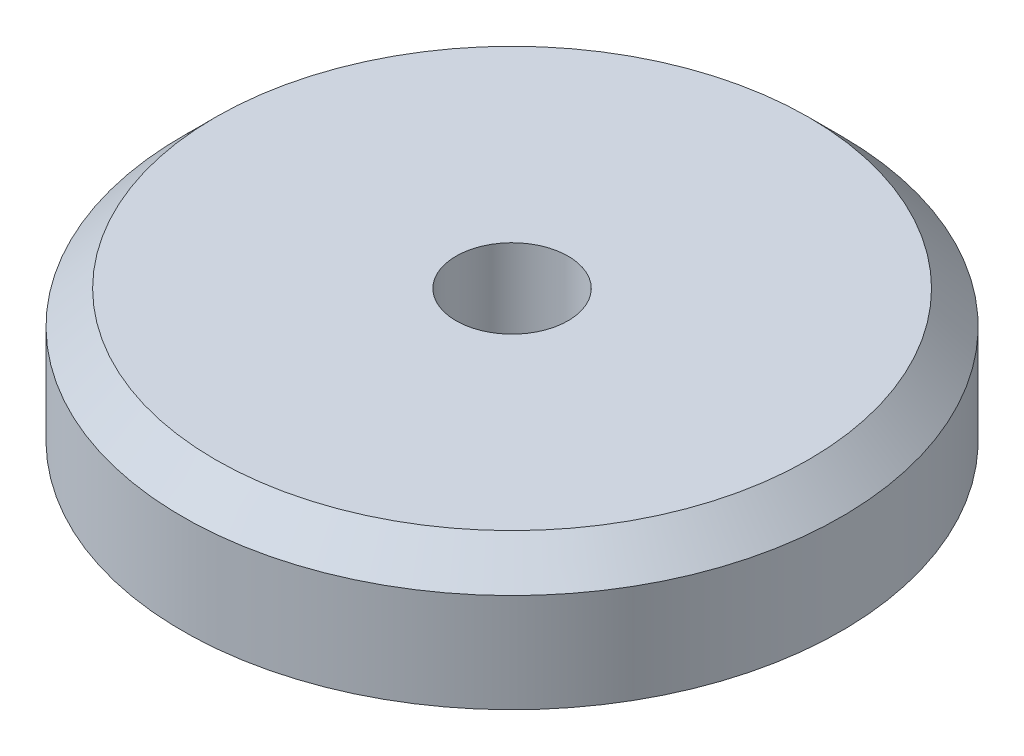
ISO-10303-21;
HEADER;
FILE_DESCRIPTION(('STEP AP214'),'2;1');
FILE_NAME('part.step','',(''),(''),'','','');
FILE_SCHEMA(('AUTOMOTIVE_DESIGN { 1 0 10303 214 1 1 1 1 }'));
ENDSEC;
DATA;
#1=APPLICATION_CONTEXT('core data for automotive mechanical design processes');
#2=APPLICATION_PROTOCOL_DEFINITION('international standard','automotive_design',2000,#1);
#3=PRODUCT_CONTEXT('',#1,'mechanical');
#4=PRODUCT('Part','Part','',(#3));
#5=PRODUCT_RELATED_PRODUCT_CATEGORY('part','',(#4));
#6=PRODUCT_DEFINITION_FORMATION('','',#4);
#7=PRODUCT_DEFINITION_CONTEXT('part definition',#1,'design');
#8=PRODUCT_DEFINITION('design','',#6,#7);
#9=PRODUCT_DEFINITION_SHAPE('','',#8);
#10=(LENGTH_UNIT() NAMED_UNIT(*) SI_UNIT(.MILLI.,.METRE.));
#11=(NAMED_UNIT(*) PLANE_ANGLE_UNIT() SI_UNIT($,.RADIAN.));
#12=(NAMED_UNIT(*) SI_UNIT($,.STERADIAN.) SOLID_ANGLE_UNIT());
#13=UNCERTAINTY_MEASURE_WITH_UNIT(LENGTH_MEASURE(1.E-05),#10,'distance_accuracy_value','');
#14=(GEOMETRIC_REPRESENTATION_CONTEXT(3) GLOBAL_UNCERTAINTY_ASSIGNED_CONTEXT((#13)) GLOBAL_UNIT_ASSIGNED_CONTEXT((#10,
#11,#12)) REPRESENTATION_CONTEXT('',''));
#15=CARTESIAN_POINT('',(0.,0.,0.));
#16=DIRECTION('',(0.,0.,1.));
#17=DIRECTION('',(1.,0.,0.));
#18=AXIS2_PLACEMENT_3D('',#15,#16,#17);
#19=CARTESIAN_POINT('',(0.,0.,0.));
#20=DIRECTION('',(0.,-1.,0.));
#21=DIRECTION('',(0.,0.,-1.));
#22=AXIS2_PLACEMENT_3D('',#19,#20,#21);
#23=PLANE('',#22);
#24=CARTESIAN_POINT('',(0.,0.,0.));
#25=DIRECTION('',(0.,-1.,0.));
#26=DIRECTION('',(0.,0.,-1.));
#27=AXIS2_PLACEMENT_3D('',#24,#25,#26);
#28=CIRCLE('',#27,4.40000000000002);
#29=CARTESIAN_POINT('',(0.,0.,-4.40000000000002));
#30=VERTEX_POINT('',#29);
#31=EDGE_CURVE('E10',#30,#30,#28,.F.);
#32=ORIENTED_EDGE('',*,*,#31,.T.);
#33=EDGE_LOOP('',(#32));
#34=FACE_BOUND('',#33,.T.);
#35=CARTESIAN_POINT('',(0.,0.,0.));
#36=DIRECTION('',(0.,-1.,0.));
#37=DIRECTION('',(0.,0.,-1.));
#38=AXIS2_PLACEMENT_3D('',#35,#36,#37);
#39=CIRCLE('',#38,13.5);
#40=CARTESIAN_POINT('',(0.,0.,-13.5));
#41=VERTEX_POINT('',#40);
#42=EDGE_CURVE('E76',#41,#41,#39,.T.);
#43=ORIENTED_EDGE('',*,*,#42,.T.);
#44=EDGE_LOOP('',(#43));
#45=FACE_BOUND('',#44,.T.);
#46=ADVANCED_FACE('F43',(#34,#45),#23,.T.);
#47=CARTESIAN_POINT('',(0.,11.,0.));
#48=DIRECTION('',(0.,1.,0.));
#49=DIRECTION('',(0.,0.,1.));
#50=AXIS2_PLACEMENT_3D('',#47,#48,#49);
#51=PLANE('',#50);
#52=CARTESIAN_POINT('',(0.,11.,0.));
#53=DIRECTION('',(0.,1.,0.));
#54=DIRECTION('',(0.,0.,1.));
#55=AXIS2_PLACEMENT_3D('',#52,#53,#54);
#56=CIRCLE('',#55,3.39999999999999);
#57=CARTESIAN_POINT('',(0.,11.,3.39999999999999));
#58=VERTEX_POINT('',#57);
#59=EDGE_CURVE('E80',#58,#58,#56,.T.);
#60=ORIENTED_EDGE('',*,*,#59,.F.);
#61=EDGE_LOOP('',(#60));
#62=FACE_BOUND('',#61,.T.);
#63=CARTESIAN_POINT('',(0.,11.,0.));
#64=DIRECTION('',(0.,-1.,0.));
#65=DIRECTION('',(0.,0.,-1.));
#66=AXIS2_PLACEMENT_3D('',#63,#64,#65);
#67=CIRCLE('',#66,18.);
#68=CARTESIAN_POINT('',(0.,11.,-18.));
#69=VERTEX_POINT('',#68);
#70=EDGE_CURVE('E57',#69,#69,#67,.T.);
#71=ORIENTED_EDGE('',*,*,#70,.F.);
#72=EDGE_LOOP('',(#71));
#73=FACE_BOUND('',#72,.T.);
#74=ADVANCED_FACE('F87',(#62,#73),#51,.T.);
#75=CARTESIAN_POINT('',(0.,9.,0.));
#76=DIRECTION('',(0.,-1.,0.));
#77=DIRECTION('',(0.,0.,-1.));
#78=AXIS2_PLACEMENT_3D('',#75,#76,#77);
#79=CONICAL_SURFACE('',#78,20.,0.785398163397449);
#80=ORIENTED_EDGE('',*,*,#70,.T.);
#81=EDGE_LOOP('',(#80));
#82=FACE_BOUND('',#81,.T.);
#83=CARTESIAN_POINT('',(0.,9.,0.));
#84=DIRECTION('',(0.,-1.,0.));
#85=DIRECTION('',(0.,0.,-1.));
#86=AXIS2_PLACEMENT_3D('',#83,#84,#85);
#87=CIRCLE('',#86,20.);
#88=CARTESIAN_POINT('',(0.,9.,-20.));
#89=VERTEX_POINT('',#88);
#90=EDGE_CURVE('E62',#89,#89,#87,.T.);
#91=ORIENTED_EDGE('',*,*,#90,.F.);
#92=EDGE_LOOP('',(#91));
#93=FACE_BOUND('',#92,.T.);
#94=ADVANCED_FACE('F90',(#82,#93),#79,.T.);
#95=CARTESIAN_POINT('',(0.,0.,0.));
#96=DIRECTION('',(0.,-1.,0.));
#97=DIRECTION('',(0.,0.,-1.));
#98=AXIS2_PLACEMENT_3D('',#95,#96,#97);
#99=CYLINDRICAL_SURFACE('',#98,20.);
#100=ORIENTED_EDGE('',*,*,#90,.T.);
#101=EDGE_LOOP('',(#100));
#102=FACE_BOUND('',#101,.T.);
#103=CARTESIAN_POINT('',(0.,3.,0.));
#104=DIRECTION('',(0.,-1.,0.));
#105=DIRECTION('',(0.,0.,-1.));
#106=AXIS2_PLACEMENT_3D('',#103,#104,#105);
#107=CIRCLE('',#106,20.);
#108=CARTESIAN_POINT('',(0.,3.,-20.));
#109=VERTEX_POINT('',#108);
#110=EDGE_CURVE('E68',#109,#109,#107,.T.);
#111=ORIENTED_EDGE('',*,*,#110,.F.);
#112=EDGE_LOOP('',(#111));
#113=FACE_BOUND('',#112,.T.);
#114=ADVANCED_FACE('F96',(#102,#113),#99,.T.);
#115=CARTESIAN_POINT('',(20.,3.,0.));
#116=DIRECTION('',(0.,-1.,0.));
#117=DIRECTION('',(0.,0.,-1.));
#118=AXIS2_PLACEMENT_3D('',#115,#116,#117);
#119=PLANE('',#118);
#120=ORIENTED_EDGE('',*,*,#110,.T.);
#121=EDGE_LOOP('',(#120));
#122=FACE_BOUND('',#121,.T.);
#123=CARTESIAN_POINT('',(0.,3.,0.));
#124=DIRECTION('',(0.,-1.,0.));
#125=DIRECTION('',(0.,0.,-1.));
#126=AXIS2_PLACEMENT_3D('',#123,#124,#125);
#127=CIRCLE('',#126,15.5);
#128=CARTESIAN_POINT('',(0.,3.,-15.5));
#129=VERTEX_POINT('',#128);
#130=EDGE_CURVE('E72',#129,#129,#127,.T.);
#131=ORIENTED_EDGE('',*,*,#130,.F.);
#132=EDGE_LOOP('',(#131));
#133=FACE_BOUND('',#132,.T.);
#134=ADVANCED_FACE('F102',(#122,#133),#119,.T.);
#135=CARTESIAN_POINT('',(0.,0.,0.));
#136=DIRECTION('',(0.,1.,0.));
#137=DIRECTION('',(0.,0.,1.));
#138=AXIS2_PLACEMENT_3D('',#135,#136,#137);
#139=CONICAL_SURFACE('',#138,13.5,0.588002603547567);
#140=ORIENTED_EDGE('',*,*,#130,.T.);
#141=EDGE_LOOP('',(#140));
#142=FACE_BOUND('',#141,.T.);
#143=ORIENTED_EDGE('',*,*,#42,.F.);
#144=EDGE_LOOP('',(#143));
#145=FACE_BOUND('',#144,.T.);
#146=ADVANCED_FACE('F108',(#142,#145),#139,.T.);
#147=CARTESIAN_POINT('',(0.,11.,0.));
#148=DIRECTION('',(0.,1.,0.));
#149=DIRECTION('',(0.,0.,1.));
#150=AXIS2_PLACEMENT_3D('',#147,#148,#149);
#151=CYLINDRICAL_SURFACE('',#150,3.39999999999999);
#152=CARTESIAN_POINT('',(0.,1.00000000000002,0.));
#153=DIRECTION('',(0.,-1.,0.));
#154=DIRECTION('',(0.,0.,-1.));
#155=AXIS2_PLACEMENT_3D('',#152,#153,#154);
#156=CIRCLE('',#155,3.39999999999999);
#157=CARTESIAN_POINT('',(0.,1.00000000000002,-3.39999999999999));
#158=VERTEX_POINT('',#157);
#159=EDGE_CURVE('E52',#158,#158,#156,.T.);
#160=ORIENTED_EDGE('',*,*,#159,.T.);
#161=EDGE_LOOP('',(#160));
#162=FACE_BOUND('',#161,.T.);
#163=ORIENTED_EDGE('',*,*,#59,.T.);
#164=EDGE_LOOP('',(#163));
#165=FACE_BOUND('',#164,.T.);
#166=ADVANCED_FACE('F85',(#162,#165),#151,.F.);
#167=CARTESIAN_POINT('',(0.,1.00000000000002,0.));
#168=DIRECTION('',(0.,-1.,0.));
#169=DIRECTION('',(0.,0.,-1.));
#170=AXIS2_PLACEMENT_3D('',#167,#168,#169);
#171=CONICAL_SURFACE('',#170,3.39999999999999,0.785398163397452);
#172=ORIENTED_EDGE('',*,*,#31,.F.);
#173=EDGE_LOOP('',(#172));
#174=FACE_BOUND('',#173,.T.);
#175=ORIENTED_EDGE('',*,*,#159,.F.);
#176=EDGE_LOOP('',(#175));
#177=FACE_BOUND('',#176,.T.);
#178=ADVANCED_FACE('F46',(#174,#177),#171,.F.);
#179=CLOSED_SHELL('',(#46,#74,#94,#114,#134,#146,#166,#178));
#180=MANIFOLD_SOLID_BREP('B2',#179);
#181=ADVANCED_BREP_SHAPE_REPRESENTATION('',(#18,#180),#14);
#182=SHAPE_DEFINITION_REPRESENTATION(#9,#181);
ENDSEC;
END-ISO-10303-21;
